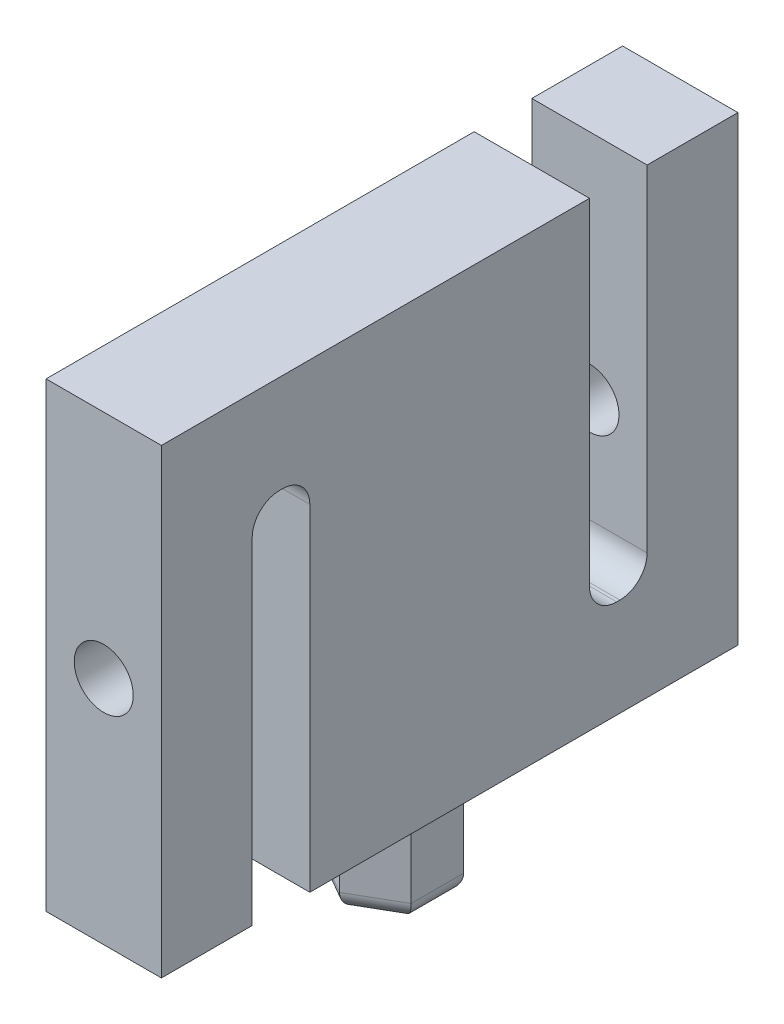
ISO-10303-21;
HEADER;
FILE_DESCRIPTION(('STEP AP214'),'2;1');
FILE_NAME('part.step','',(''),(''),'','','');
FILE_SCHEMA(('AUTOMOTIVE_DESIGN { 1 0 10303 214 1 1 1 1 }'));
ENDSEC;
DATA;
#1=APPLICATION_CONTEXT('core data for automotive mechanical design processes');
#2=APPLICATION_PROTOCOL_DEFINITION('international standard','automotive_design',2000,#1);
#3=PRODUCT_CONTEXT('',#1,'mechanical');
#4=PRODUCT('Part','Part','',(#3));
#5=PRODUCT_RELATED_PRODUCT_CATEGORY('part','',(#4));
#6=PRODUCT_DEFINITION_FORMATION('','',#4);
#7=PRODUCT_DEFINITION_CONTEXT('part definition',#1,'design');
#8=PRODUCT_DEFINITION('design','',#6,#7);
#9=PRODUCT_DEFINITION_SHAPE('','',#8);
#10=(LENGTH_UNIT() NAMED_UNIT(*) SI_UNIT(.MILLI.,.METRE.));
#11=(NAMED_UNIT(*) PLANE_ANGLE_UNIT() SI_UNIT($,.RADIAN.));
#12=(NAMED_UNIT(*) SI_UNIT($,.STERADIAN.) SOLID_ANGLE_UNIT());
#13=UNCERTAINTY_MEASURE_WITH_UNIT(LENGTH_MEASURE(1.E-05),#10,'distance_accuracy_value','');
#14=(GEOMETRIC_REPRESENTATION_CONTEXT(3) GLOBAL_UNCERTAINTY_ASSIGNED_CONTEXT((#13)) GLOBAL_UNIT_ASSIGNED_CONTEXT((#10,
#11,#12)) REPRESENTATION_CONTEXT('',''));
#15=CARTESIAN_POINT('',(0.,0.,0.));
#16=DIRECTION('',(0.,0.,1.));
#17=DIRECTION('',(1.,0.,0.));
#18=AXIS2_PLACEMENT_3D('',#15,#16,#17);
#19=CARTESIAN_POINT('',(0.,244.,70.4264973081038));
#20=DIRECTION('',(-0.5,0.,0.866025403784439));
#21=DIRECTION('',(0.866025403784439,0.,0.5));
#22=AXIS2_PLACEMENT_3D('',#19,#20,#21);
#23=PLANE('',#22);
#24=DIRECTION('',(0.,1.,0.));
#25=VECTOR('',#24,1.);
#26=CARTESIAN_POINT('',(5.,244.,73.3132486540519));
#27=LINE('',#26,#25);
#28=CARTESIAN_POINT('',(5.,246.,73.3132486540519));
#29=VERTEX_POINT('',#28);
#30=CARTESIAN_POINT('',(5.,254.,73.3132486540519));
#31=VERTEX_POINT('',#30);
#32=EDGE_CURVE('E127',#29,#31,#27,.T.);
#33=ORIENTED_EDGE('',*,*,#32,.F.);
#34=DIRECTION('',(0.866025403784439,0.,0.5));
#35=VECTOR('',#34,1.);
#36=CARTESIAN_POINT('',(0.,246.,70.4264973081038));
#37=LINE('',#36,#35);
#38=CARTESIAN_POINT('',(0.,246.,70.4264973081038));
#39=VERTEX_POINT('',#38);
#40=EDGE_CURVE('E12',#29,#39,#37,.F.);
#41=ORIENTED_EDGE('',*,*,#40,.T.);
#42=DIRECTION('',(0.,1.,0.));
#43=VECTOR('',#42,1.);
#44=CARTESIAN_POINT('',(0.,244.,70.4264973081038));
#45=LINE('',#44,#43);
#46=CARTESIAN_POINT('',(0.,254.,70.4264973081038));
#47=VERTEX_POINT('',#46);
#48=EDGE_CURVE('E148',#39,#47,#45,.T.);
#49=ORIENTED_EDGE('',*,*,#48,.T.);
#50=DIRECTION('',(0.866025403784439,0.,0.5));
#51=VECTOR('',#50,1.);
#52=CARTESIAN_POINT('',(0.,254.,70.4264973081038));
#53=LINE('',#52,#51);
#54=EDGE_CURVE('E142',#47,#31,#53,.T.);
#55=ORIENTED_EDGE('',*,*,#54,.T.);
#56=EDGE_LOOP('',(#33,#41,#49,#55));
#57=FACE_BOUND('',#56,.T.);
#58=ADVANCED_FACE('F57',(#57),#23,.F.);
#59=CARTESIAN_POINT('',(5.,244.,73.3132486540519));
#60=DIRECTION('',(-1.,0.,0.));
#61=DIRECTION('',(0.,0.,1.));
#62=AXIS2_PLACEMENT_3D('',#59,#60,#61);
#63=PLANE('',#62);
#64=DIRECTION('',(0.,1.,0.));
#65=VECTOR('',#64,1.);
#66=CARTESIAN_POINT('',(5.,244.,79.0867513459482));
#67=LINE('',#66,#65);
#68=CARTESIAN_POINT('',(5.,246.,79.0867513459482));
#69=VERTEX_POINT('',#68);
#70=CARTESIAN_POINT('',(5.,254.,79.0867513459482));
#71=VERTEX_POINT('',#70);
#72=EDGE_CURVE('E136',#69,#71,#67,.T.);
#73=ORIENTED_EDGE('',*,*,#72,.F.);
#74=DIRECTION('',(0.,0.,1.));
#75=VECTOR('',#74,1.);
#76=CARTESIAN_POINT('',(5.,246.,73.3132486540519));
#77=LINE('',#76,#75);
#78=EDGE_CURVE('E66',#69,#29,#77,.F.);
#79=ORIENTED_EDGE('',*,*,#78,.T.);
#80=ORIENTED_EDGE('',*,*,#32,.T.);
#81=DIRECTION('',(0.,0.,1.));
#82=VECTOR('',#81,1.);
#83=CARTESIAN_POINT('',(5.,254.,73.3132486540519));
#84=LINE('',#83,#82);
#85=EDGE_CURVE('E130',#31,#71,#84,.T.);
#86=ORIENTED_EDGE('',*,*,#85,.T.);
#87=EDGE_LOOP('',(#73,#79,#80,#86));
#88=FACE_BOUND('',#87,.T.);
#89=ADVANCED_FACE('F129',(#88),#63,.F.);
#90=CARTESIAN_POINT('',(5.,244.,79.0867513459482));
#91=DIRECTION('',(-0.499999999999999,0.,-0.866025403784439));
#92=DIRECTION('',(-0.866025403784439,0.,0.499999999999999));
#93=AXIS2_PLACEMENT_3D('',#90,#91,#92);
#94=PLANE('',#93);
#95=DIRECTION('',(0.,1.,0.));
#96=VECTOR('',#95,1.);
#97=CARTESIAN_POINT('',(0.,244.,81.9735026918963));
#98=LINE('',#97,#96);
#99=CARTESIAN_POINT('',(0.,246.,81.9735026918963));
#100=VERTEX_POINT('',#99);
#101=CARTESIAN_POINT('',(0.,254.,81.9735026918963));
#102=VERTEX_POINT('',#101);
#103=EDGE_CURVE('E168',#100,#102,#98,.T.);
#104=ORIENTED_EDGE('',*,*,#103,.F.);
#105=DIRECTION('',(-0.866025403784439,0.,0.499999999999999));
#106=VECTOR('',#105,1.);
#107=CARTESIAN_POINT('',(5.00000000000001,246.,79.0867513459482));
#108=LINE('',#107,#106);
#109=EDGE_CURVE('E81',#100,#69,#108,.F.);
#110=ORIENTED_EDGE('',*,*,#109,.T.);
#111=ORIENTED_EDGE('',*,*,#72,.T.);
#112=DIRECTION('',(-0.866025403784439,0.,0.499999999999999));
#113=VECTOR('',#112,1.);
#114=CARTESIAN_POINT('',(5.,254.,79.0867513459482));
#115=LINE('',#114,#113);
#116=EDGE_CURVE('E145',#71,#102,#115,.T.);
#117=ORIENTED_EDGE('',*,*,#116,.T.);
#118=EDGE_LOOP('',(#104,#110,#111,#117));
#119=FACE_BOUND('',#118,.T.);
#120=ADVANCED_FACE('F251',(#119),#94,.F.);
#121=CARTESIAN_POINT('',(0.,244.,81.9735026918963));
#122=DIRECTION('',(0.5,0.,-0.866025403784439));
#123=DIRECTION('',(-0.866025403784439,0.,-0.5));
#124=AXIS2_PLACEMENT_3D('',#121,#122,#123);
#125=PLANE('',#124);
#126=DIRECTION('',(0.,1.,0.));
#127=VECTOR('',#126,1.);
#128=CARTESIAN_POINT('',(-5.,244.,79.0867513459482));
#129=LINE('',#128,#127);
#130=CARTESIAN_POINT('',(-5.,246.,79.0867513459482));
#131=VERTEX_POINT('',#130);
#132=CARTESIAN_POINT('',(-5.,254.,79.0867513459482));
#133=VERTEX_POINT('',#132);
#134=EDGE_CURVE('E166',#131,#133,#129,.T.);
#135=ORIENTED_EDGE('',*,*,#134,.F.);
#136=DIRECTION('',(-0.866025403784439,0.,-0.5));
#137=VECTOR('',#136,1.);
#138=CARTESIAN_POINT('',(0.,246.,81.9735026918963));
#139=LINE('',#138,#137);
#140=EDGE_CURVE('E188',#131,#100,#139,.F.);
#141=ORIENTED_EDGE('',*,*,#140,.T.);
#142=ORIENTED_EDGE('',*,*,#103,.T.);
#143=DIRECTION('',(-0.866025403784439,0.,-0.5));
#144=VECTOR('',#143,1.);
#145=CARTESIAN_POINT('',(0.,254.,81.9735026918963));
#146=LINE('',#145,#144);
#147=EDGE_CURVE('E155',#102,#133,#146,.T.);
#148=ORIENTED_EDGE('',*,*,#147,.T.);
#149=EDGE_LOOP('',(#135,#141,#142,#148));
#150=FACE_BOUND('',#149,.T.);
#151=ADVANCED_FACE('F235',(#150),#125,.F.);
#152=CARTESIAN_POINT('',(-5.,244.,79.0867513459482));
#153=DIRECTION('',(1.,0.,0.));
#154=DIRECTION('',(0.,0.,-1.));
#155=AXIS2_PLACEMENT_3D('',#152,#153,#154);
#156=PLANE('',#155);
#157=DIRECTION('',(0.,1.,0.));
#158=VECTOR('',#157,1.);
#159=CARTESIAN_POINT('',(-5.,244.,73.3132486540519));
#160=LINE('',#159,#158);
#161=CARTESIAN_POINT('',(-5.,246.,73.3132486540519));
#162=VERTEX_POINT('',#161);
#163=CARTESIAN_POINT('',(-5.,254.,73.3132486540519));
#164=VERTEX_POINT('',#163);
#165=EDGE_CURVE('E164',#162,#164,#160,.T.);
#166=ORIENTED_EDGE('',*,*,#165,.F.);
#167=DIRECTION('',(0.,0.,-1.));
#168=VECTOR('',#167,1.);
#169=CARTESIAN_POINT('',(-5.,246.,79.0867513459482));
#170=LINE('',#169,#168);
#171=EDGE_CURVE('E186',#162,#131,#170,.F.);
#172=ORIENTED_EDGE('',*,*,#171,.T.);
#173=ORIENTED_EDGE('',*,*,#134,.T.);
#174=DIRECTION('',(0.,0.,-1.));
#175=VECTOR('',#174,1.);
#176=CARTESIAN_POINT('',(-5.,254.,79.0867513459482));
#177=LINE('',#176,#175);
#178=EDGE_CURVE('E158',#133,#164,#177,.T.);
#179=ORIENTED_EDGE('',*,*,#178,.T.);
#180=EDGE_LOOP('',(#166,#172,#173,#179));
#181=FACE_BOUND('',#180,.T.);
#182=ADVANCED_FACE('F232',(#181),#156,.F.);
#183=CARTESIAN_POINT('',(-5.,244.,73.3132486540519));
#184=DIRECTION('',(0.499999999999999,0.,0.866025403784439));
#185=DIRECTION('',(0.866025403784439,0.,-0.5));
#186=AXIS2_PLACEMENT_3D('',#183,#184,#185);
#187=PLANE('',#186);
#188=ORIENTED_EDGE('',*,*,#48,.F.);
#189=DIRECTION('',(0.866025403784439,0.,-0.5));
#190=VECTOR('',#189,1.);
#191=CARTESIAN_POINT('',(-5.,246.,73.3132486540519));
#192=LINE('',#191,#190);
#193=EDGE_CURVE('E183',#39,#162,#192,.F.);
#194=ORIENTED_EDGE('',*,*,#193,.T.);
#195=ORIENTED_EDGE('',*,*,#165,.T.);
#196=DIRECTION('',(0.866025403784439,0.,-0.499999999999999));
#197=VECTOR('',#196,1.);
#198=CARTESIAN_POINT('',(-5.,254.,73.3132486540519));
#199=LINE('',#198,#197);
#200=EDGE_CURVE('E161',#164,#47,#199,.T.);
#201=ORIENTED_EDGE('',*,*,#200,.T.);
#202=EDGE_LOOP('',(#188,#194,#195,#201));
#203=FACE_BOUND('',#202,.T.);
#204=ADVANCED_FACE('F221',(#203),#187,.F.);
#205=CARTESIAN_POINT('',(0.,244.,0.));
#206=DIRECTION('',(0.,-1.,0.));
#207=DIRECTION('',(0.,0.,-1.));
#208=AXIS2_PLACEMENT_3D('',#205,#206,#207);
#209=PLANE('',#208);
#210=DIRECTION('',(0.,0.,-1.));
#211=VECTOR('',#210,1.);
#212=CARTESIAN_POINT('',(-3.,244.,73.3132486540519));
#213=LINE('',#212,#211);
#214=CARTESIAN_POINT('',(-3.,244.,77.9320508075689));
#215=VERTEX_POINT('',#214);
#216=CARTESIAN_POINT('',(-3.,244.,74.4679491924312));
#217=VERTEX_POINT('',#216);
#218=EDGE_CURVE('E178',#215,#217,#213,.T.);
#219=ORIENTED_EDGE('',*,*,#218,.T.);
#220=DIRECTION('',(0.866025403784439,0.,-0.5));
#221=VECTOR('',#220,1.);
#222=CARTESIAN_POINT('',(1.00000000000001,244.,72.1585481156727));
#223=LINE('',#222,#221);
#224=CARTESIAN_POINT('',(0.,244.,72.7358983848623));
#225=VERTEX_POINT('',#224);
#226=EDGE_CURVE('E180',#217,#225,#223,.T.);
#227=ORIENTED_EDGE('',*,*,#226,.T.);
#228=DIRECTION('',(0.866025403784439,0.,0.5));
#229=VECTOR('',#228,1.);
#230=CARTESIAN_POINT('',(4.00000000000002,244.,75.0452994616208));
#231=LINE('',#230,#229);
#232=CARTESIAN_POINT('',(3.,244.,74.4679491924311));
#233=VERTEX_POINT('',#232);
#234=EDGE_CURVE('E135',#225,#233,#231,.T.);
#235=ORIENTED_EDGE('',*,*,#234,.T.);
#236=DIRECTION('',(0.,0.,1.));
#237=VECTOR('',#236,1.);
#238=CARTESIAN_POINT('',(3.,244.,79.0867513459482));
#239=LINE('',#238,#237);
#240=CARTESIAN_POINT('',(3.,244.,77.9320508075689));
#241=VERTEX_POINT('',#240);
#242=EDGE_CURVE('E172',#233,#241,#239,.T.);
#243=ORIENTED_EDGE('',*,*,#242,.T.);
#244=DIRECTION('',(-0.866025403784439,0.,0.499999999999999));
#245=VECTOR('',#244,1.);
#246=CARTESIAN_POINT('',(-0.999999999999973,244.,80.2414518843274));
#247=LINE('',#246,#245);
#248=CARTESIAN_POINT('',(0.,244.,79.6641016151378));
#249=VERTEX_POINT('',#248);
#250=EDGE_CURVE('E174',#241,#249,#247,.T.);
#251=ORIENTED_EDGE('',*,*,#250,.T.);
#252=DIRECTION('',(-0.866025403784439,0.,-0.5));
#253=VECTOR('',#252,1.);
#254=CARTESIAN_POINT('',(-4.00000000000001,244.,77.3547005383793));
#255=LINE('',#254,#253);
#256=EDGE_CURVE('E176',#249,#215,#255,.T.);
#257=ORIENTED_EDGE('',*,*,#256,.T.);
#258=EDGE_LOOP('',(#219,#227,#235,#243,#251,#257));
#259=FACE_BOUND('',#258,.T.);
#260=ADVANCED_FACE('F211',(#259),#209,.T.);
#261=CARTESIAN_POINT('',(0.,254.,0.));
#262=DIRECTION('',(0.,-1.,0.));
#263=DIRECTION('',(0.,0.,-1.));
#264=AXIS2_PLACEMENT_3D('',#261,#262,#263);
#265=PLANE('',#264);
#266=ORIENTED_EDGE('',*,*,#54,.F.);
#267=ORIENTED_EDGE('',*,*,#200,.F.);
#268=ORIENTED_EDGE('',*,*,#178,.F.);
#269=ORIENTED_EDGE('',*,*,#147,.F.);
#270=ORIENTED_EDGE('',*,*,#116,.F.);
#271=ORIENTED_EDGE('',*,*,#85,.F.);
#272=EDGE_LOOP('',(#266,#267,#268,#269,#270,#271));
#273=FACE_BOUND('',#272,.T.);
#274=ADVANCED_FACE('F140',(#273),#265,.F.);
#275=CARTESIAN_POINT('',(34.4955678841871,246.,59.7480762113534));
#276=DIRECTION('',(0.866025403784439,0.,-0.499999999999999));
#277=DIRECTION('',(-0.499999999999999,0.,-0.866025403784439));
#278=AXIS2_PLACEMENT_3D('',#275,#276,#277);
#279=CYLINDRICAL_SURFACE('',#278,2.);
#280=CARTESIAN_POINT('',(3.,246.,77.9320508075689));
#281=DIRECTION('',(0.5,0.,-0.866025403784438));
#282=DIRECTION('',(-0.866025403784438,0.,-0.5));
#283=AXIS2_PLACEMENT_3D('',#280,#281,#282);
#284=ELLIPSE('',#283,2.3094010767585,2.);
#285=EDGE_CURVE('E152',#69,#241,#284,.T.);
#286=ORIENTED_EDGE('',*,*,#285,.F.);
#287=ORIENTED_EDGE('',*,*,#109,.F.);
#288=CARTESIAN_POINT('',(0.,246.,79.6641016151378));
#289=DIRECTION('',(1.,0.,0.));
#290=DIRECTION('',(0.,0.,-1.));
#291=AXIS2_PLACEMENT_3D('',#288,#289,#290);
#292=ELLIPSE('',#291,2.3094010767585,2.);
#293=EDGE_CURVE('E61',#249,#100,#292,.F.);
#294=ORIENTED_EDGE('',*,*,#293,.F.);
#295=ORIENTED_EDGE('',*,*,#250,.F.);
#296=EDGE_LOOP('',(#286,#287,#294,#295));
#297=FACE_BOUND('',#296,.T.);
#298=ADVANCED_FACE('F59',(#297),#279,.T.);
#299=CARTESIAN_POINT('',(-34.4955678841871,246.,59.7480762113534));
#300=DIRECTION('',(0.866025403784439,0.,0.5));
#301=DIRECTION('',(0.5,0.,-0.866025403784439));
#302=AXIS2_PLACEMENT_3D('',#299,#300,#301);
#303=CYLINDRICAL_SURFACE('',#302,2.);
#304=ORIENTED_EDGE('',*,*,#293,.T.);
#305=ORIENTED_EDGE('',*,*,#140,.F.);
#306=CARTESIAN_POINT('',(-3.,246.,77.9320508075689));
#307=DIRECTION('',(0.5,0.,0.866025403784438));
#308=DIRECTION('',(0.866025403784439,0.,-0.5));
#309=AXIS2_PLACEMENT_3D('',#306,#307,#308);
#310=ELLIPSE('',#309,2.3094010767585,2.);
#311=EDGE_CURVE('E199',#215,#131,#310,.F.);
#312=ORIENTED_EDGE('',*,*,#311,.F.);
#313=ORIENTED_EDGE('',*,*,#256,.F.);
#314=EDGE_LOOP('',(#304,#305,#312,#313));
#315=FACE_BOUND('',#314,.T.);
#316=ADVANCED_FACE('F238',(#315),#303,.T.);
#317=CARTESIAN_POINT('',(3.,246.,0.));
#318=DIRECTION('',(0.,0.,-1.));
#319=DIRECTION('',(-1.,0.,0.));
#320=AXIS2_PLACEMENT_3D('',#317,#318,#319);
#321=CYLINDRICAL_SURFACE('',#320,2.);
#322=ORIENTED_EDGE('',*,*,#285,.T.);
#323=ORIENTED_EDGE('',*,*,#242,.F.);
#324=CARTESIAN_POINT('',(3.,246.,74.4679491924311));
#325=DIRECTION('',(-0.5,0.,-0.866025403784438));
#326=DIRECTION('',(-0.866025403784439,0.,0.5));
#327=AXIS2_PLACEMENT_3D('',#324,#325,#326);
#328=ELLIPSE('',#327,2.3094010767585,2.);
#329=EDGE_CURVE('E196',#29,#233,#328,.T.);
#330=ORIENTED_EDGE('',*,*,#329,.F.);
#331=ORIENTED_EDGE('',*,*,#78,.F.);
#332=EDGE_LOOP('',(#322,#323,#330,#331));
#333=FACE_BOUND('',#332,.T.);
#334=ADVANCED_FACE('F205',(#333),#321,.T.);
#335=CARTESIAN_POINT('',(-2.99999999999999,246.,0.));
#336=DIRECTION('',(0.,0.,1.));
#337=DIRECTION('',(1.,0.,0.));
#338=AXIS2_PLACEMENT_3D('',#335,#336,#337);
#339=CYLINDRICAL_SURFACE('',#338,2.);
#340=ORIENTED_EDGE('',*,*,#311,.T.);
#341=ORIENTED_EDGE('',*,*,#171,.F.);
#342=CARTESIAN_POINT('',(-3.,246.,74.4679491924311));
#343=DIRECTION('',(-0.5,0.,0.866025403784438));
#344=DIRECTION('',(0.866025403784439,0.,0.5));
#345=AXIS2_PLACEMENT_3D('',#342,#343,#344);
#346=ELLIPSE('',#345,2.3094010767585,2.);
#347=EDGE_CURVE('E194',#217,#162,#346,.F.);
#348=ORIENTED_EDGE('',*,*,#347,.F.);
#349=ORIENTED_EDGE('',*,*,#218,.F.);
#350=EDGE_LOOP('',(#340,#341,#348,#349));
#351=FACE_BOUND('',#350,.T.);
#352=ADVANCED_FACE('F229',(#351),#339,.T.);
#353=CARTESIAN_POINT('',(-31.4955678841871,246.,54.5519237886467));
#354=DIRECTION('',(-0.866025403784439,0.,-0.5));
#355=DIRECTION('',(-0.5,0.,0.866025403784439));
#356=AXIS2_PLACEMENT_3D('',#353,#354,#355);
#357=CYLINDRICAL_SURFACE('',#356,2.);
#358=ORIENTED_EDGE('',*,*,#329,.T.);
#359=ORIENTED_EDGE('',*,*,#234,.F.);
#360=CARTESIAN_POINT('',(0.,246.,72.7358983848623));
#361=DIRECTION('',(-1.,0.,0.));
#362=DIRECTION('',(0.,0.,-1.));
#363=AXIS2_PLACEMENT_3D('',#360,#361,#362);
#364=ELLIPSE('',#363,2.3094010767585,2.);
#365=EDGE_CURVE('E192',#39,#225,#364,.T.);
#366=ORIENTED_EDGE('',*,*,#365,.F.);
#367=ORIENTED_EDGE('',*,*,#40,.F.);
#368=EDGE_LOOP('',(#358,#359,#366,#367));
#369=FACE_BOUND('',#368,.T.);
#370=ADVANCED_FACE('F217',(#369),#357,.T.);
#371=CARTESIAN_POINT('',(31.4955678841871,246.,54.5519237886468));
#372=DIRECTION('',(-0.866025403784439,0.,0.5));
#373=DIRECTION('',(0.499999999999999,0.,0.866025403784439));
#374=AXIS2_PLACEMENT_3D('',#371,#372,#373);
#375=CYLINDRICAL_SURFACE('',#374,2.);
#376=ORIENTED_EDGE('',*,*,#347,.T.);
#377=ORIENTED_EDGE('',*,*,#193,.F.);
#378=ORIENTED_EDGE('',*,*,#365,.T.);
#379=ORIENTED_EDGE('',*,*,#226,.F.);
#380=EDGE_LOOP('',(#376,#377,#378,#379));
#381=FACE_BOUND('',#380,.T.);
#382=ADVANCED_FACE('F224',(#381),#375,.T.);
#383=CLOSED_SHELL('',(#58,#89,#120,#151,#182,#204,#260,#274,#298,#316,#334,#352,#370,#382));
#384=MANIFOLD_SOLID_BREP('B2',#383);
#385=CARTESIAN_POINT('',(6.35,264.8,54.45));
#386=DIRECTION('',(0.,-1.,0.));
#387=DIRECTION('',(0.,0.,-1.));
#388=AXIS2_PLACEMENT_3D('',#385,#386,#387);
#389=PLANE('',#388);
#390=DIRECTION('',(0.,0.,1.));
#391=VECTOR('',#390,1.);
#392=CARTESIAN_POINT('',(-6.35,264.8,54.45));
#393=LINE('',#392,#391);
#394=CARTESIAN_POINT('',(-6.35,264.8,57.45));
#395=VERTEX_POINT('',#394);
#396=CARTESIAN_POINT('',(-6.35,264.8,57.8));
#397=VERTEX_POINT('',#396);
#398=EDGE_CURVE('E516',#395,#397,#393,.T.);
#399=ORIENTED_EDGE('',*,*,#398,.T.);
#400=DIRECTION('',(-1.,0.,0.));
#401=VECTOR('',#400,1.);
#402=CARTESIAN_POINT('',(6.35,264.8,57.8));
#403=LINE('',#402,#401);
#404=CARTESIAN_POINT('',(6.35,264.8,57.8));
#405=VERTEX_POINT('',#404);
#406=EDGE_CURVE('E565',#397,#405,#403,.F.);
#407=ORIENTED_EDGE('',*,*,#406,.T.);
#408=DIRECTION('',(0.,0.,1.));
#409=VECTOR('',#408,1.);
#410=CARTESIAN_POINT('',(6.35,264.8,54.45));
#411=LINE('',#410,#409);
#412=CARTESIAN_POINT('',(6.35,264.8,57.45));
#413=VERTEX_POINT('',#412);
#414=EDGE_CURVE('E478',#413,#405,#411,.T.);
#415=ORIENTED_EDGE('',*,*,#414,.F.);
#416=DIRECTION('',(-1.,0.,0.));
#417=VECTOR('',#416,1.);
#418=CARTESIAN_POINT('',(-6.35,264.8,57.45));
#419=LINE('',#418,#417);
#420=EDGE_CURVE('E562',#413,#395,#419,.T.);
#421=ORIENTED_EDGE('',*,*,#420,.T.);
#422=EDGE_LOOP('',(#399,#407,#415,#421));
#423=FACE_BOUND('',#422,.T.);
#424=ADVANCED_FACE('F353',(#423),#389,.F.);
#425=CARTESIAN_POINT('',(6.35,264.8,60.8));
#426=DIRECTION('',(0.,0.,1.));
#427=DIRECTION('',(0.,-1.,0.));
#428=AXIS2_PLACEMENT_3D('',#425,#426,#427);
#429=PLANE('',#428);
#430=DIRECTION('',(0.,1.,0.));
#431=VECTOR('',#430,1.);
#432=CARTESIAN_POINT('',(6.35,264.8,60.8));
#433=LINE('',#432,#431);
#434=CARTESIAN_POINT('',(6.35,267.8,60.8));
#435=VERTEX_POINT('',#434);
#436=CARTESIAN_POINT('',(6.35,304.8,60.8));
#437=VERTEX_POINT('',#436);
#438=EDGE_CURVE('E465',#435,#437,#433,.T.);
#439=ORIENTED_EDGE('',*,*,#438,.F.);
#440=DIRECTION('',(-1.,0.,0.));
#441=VECTOR('',#440,1.);
#442=CARTESIAN_POINT('',(-6.35,267.8,60.8));
#443=LINE('',#442,#441);
#444=CARTESIAN_POINT('',(-6.35,267.8,60.8));
#445=VERTEX_POINT('',#444);
#446=EDGE_CURVE('E487',#435,#445,#443,.T.);
#447=ORIENTED_EDGE('',*,*,#446,.T.);
#448=DIRECTION('',(0.,1.,0.));
#449=VECTOR('',#448,1.);
#450=CARTESIAN_POINT('',(-6.35,264.8,60.8));
#451=LINE('',#450,#449);
#452=CARTESIAN_POINT('',(-6.35,304.8,60.8));
#453=VERTEX_POINT('',#452);
#454=EDGE_CURVE('E484',#445,#453,#451,.T.);
#455=ORIENTED_EDGE('',*,*,#454,.T.);
#456=DIRECTION('',(-1.,0.,0.));
#457=VECTOR('',#456,1.);
#458=CARTESIAN_POINT('',(6.35,304.8,60.8));
#459=LINE('',#458,#457);
#460=EDGE_CURVE('E481',#437,#453,#459,.T.);
#461=ORIENTED_EDGE('',*,*,#460,.F.);
#462=EDGE_LOOP('',(#439,#447,#455,#461));
#463=FACE_BOUND('',#462,.T.);
#464=ADVANCED_FACE('F482',(#463),#429,.F.);
#465=CARTESIAN_POINT('',(6.35,304.8,60.8));
#466=DIRECTION('',(0.,-1.,0.));
#467=DIRECTION('',(0.,0.,-1.));
#468=AXIS2_PLACEMENT_3D('',#465,#466,#467);
#469=PLANE('',#468);
#470=DIRECTION('',(0.,0.,1.));
#471=VECTOR('',#470,1.);
#472=CARTESIAN_POINT('',(-6.35,304.8,60.8));
#473=LINE('',#472,#471);
#474=CARTESIAN_POINT('',(-6.35,304.8,107.95));
#475=VERTEX_POINT('',#474);
#476=EDGE_CURVE('E521',#453,#475,#473,.T.);
#477=ORIENTED_EDGE('',*,*,#476,.T.);
#478=DIRECTION('',(-1.,0.,0.));
#479=VECTOR('',#478,1.);
#480=CARTESIAN_POINT('',(6.35,304.8,107.95));
#481=LINE('',#480,#479);
#482=CARTESIAN_POINT('',(6.35,304.8,107.95));
#483=VERTEX_POINT('',#482);
#484=EDGE_CURVE('E488',#483,#475,#481,.T.);
#485=ORIENTED_EDGE('',*,*,#484,.F.);
#486=DIRECTION('',(0.,0.,1.));
#487=VECTOR('',#486,1.);
#488=CARTESIAN_POINT('',(6.35,304.8,60.8));
#489=LINE('',#488,#487);
#490=EDGE_CURVE('E470',#437,#483,#489,.T.);
#491=ORIENTED_EDGE('',*,*,#490,.F.);
#492=ORIENTED_EDGE('',*,*,#460,.T.);
#493=EDGE_LOOP('',(#477,#485,#491,#492));
#494=FACE_BOUND('',#493,.T.);
#495=ADVANCED_FACE('F490',(#494),#469,.F.);
#496=CARTESIAN_POINT('',(6.35,304.8,107.95));
#497=DIRECTION('',(0.,0.,-1.));
#498=DIRECTION('',(-1.,0.,0.));
#499=AXIS2_PLACEMENT_3D('',#496,#497,#498);
#500=PLANE('',#499);
#501=CARTESIAN_POINT('',(0.,279.4,107.95));
#502=DIRECTION('',(0.,0.,-1.));
#503=DIRECTION('',(0.,1.,0.));
#504=AXIS2_PLACEMENT_3D('',#501,#502,#503);
#505=CIRCLE('',#504,3.25);
#506=CARTESIAN_POINT('',(0.,282.65,107.95));
#507=VERTEX_POINT('',#506);
#508=EDGE_CURVE('E699',#507,#507,#505,.T.);
#509=ORIENTED_EDGE('',*,*,#508,.T.);
#510=EDGE_LOOP('',(#509));
#511=FACE_BOUND('',#510,.T.);
#512=DIRECTION('',(0.,-1.,0.));
#513=VECTOR('',#512,1.);
#514=CARTESIAN_POINT('',(-6.35,304.8,107.95));
#515=LINE('',#514,#513);
#516=CARTESIAN_POINT('',(-6.35,254.,107.95));
#517=VERTEX_POINT('',#516);
#518=EDGE_CURVE('E523',#475,#517,#515,.T.);
#519=ORIENTED_EDGE('',*,*,#518,.T.);
#520=DIRECTION('',(-1.,0.,0.));
#521=VECTOR('',#520,1.);
#522=CARTESIAN_POINT('',(6.35,254.,107.95));
#523=LINE('',#522,#521);
#524=CARTESIAN_POINT('',(6.35,254.,107.95));
#525=VERTEX_POINT('',#524);
#526=EDGE_CURVE('E557',#525,#517,#523,.T.);
#527=ORIENTED_EDGE('',*,*,#526,.F.);
#528=DIRECTION('',(0.,-1.,0.));
#529=VECTOR('',#528,1.);
#530=CARTESIAN_POINT('',(6.35,304.8,107.95));
#531=LINE('',#530,#529);
#532=EDGE_CURVE('E493',#483,#525,#531,.T.);
#533=ORIENTED_EDGE('',*,*,#532,.F.);
#534=ORIENTED_EDGE('',*,*,#484,.T.);
#535=EDGE_LOOP('',(#519,#527,#533,#534));
#536=FACE_BOUND('',#535,.T.);
#537=ADVANCED_FACE('F617',(#511,#536),#500,.F.);
#538=CARTESIAN_POINT('',(6.35,254.,107.95));
#539=DIRECTION('',(0.,1.,0.));
#540=DIRECTION('',(0.,0.,1.));
#541=AXIS2_PLACEMENT_3D('',#538,#539,#540);
#542=PLANE('',#541);
#543=DIRECTION('',(0.,0.,-1.));
#544=VECTOR('',#543,1.);
#545=CARTESIAN_POINT('',(-6.35,254.,107.95));
#546=LINE('',#545,#544);
#547=CARTESIAN_POINT('',(-6.35,254.,97.95));
#548=VERTEX_POINT('',#547);
#549=EDGE_CURVE('E525',#517,#548,#546,.T.);
#550=ORIENTED_EDGE('',*,*,#549,.T.);
#551=DIRECTION('',(-1.,0.,0.));
#552=VECTOR('',#551,1.);
#553=CARTESIAN_POINT('',(6.35,254.,97.95));
#554=LINE('',#553,#552);
#555=CARTESIAN_POINT('',(6.35,254.,97.95));
#556=VERTEX_POINT('',#555);
#557=EDGE_CURVE('E554',#556,#548,#554,.T.);
#558=ORIENTED_EDGE('',*,*,#557,.F.);
#559=DIRECTION('',(0.,0.,-1.));
#560=VECTOR('',#559,1.);
#561=CARTESIAN_POINT('',(6.35,254.,107.95));
#562=LINE('',#561,#560);
#563=EDGE_CURVE('E495',#525,#556,#562,.T.);
#564=ORIENTED_EDGE('',*,*,#563,.F.);
#565=ORIENTED_EDGE('',*,*,#526,.T.);
#566=EDGE_LOOP('',(#550,#558,#564,#565));
#567=FACE_BOUND('',#566,.T.);
#568=ADVANCED_FACE('F614',(#567),#542,.F.);
#569=CARTESIAN_POINT('',(6.35,254.,97.95));
#570=DIRECTION('',(0.,0.,1.));
#571=DIRECTION('',(0.,-1.,0.));
#572=AXIS2_PLACEMENT_3D('',#569,#570,#571);
#573=PLANE('',#572);
#574=CARTESIAN_POINT('',(0.,279.4,97.95));
#575=DIRECTION('',(0.,0.,1.));
#576=DIRECTION('',(0.,-1.,0.));
#577=AXIS2_PLACEMENT_3D('',#574,#575,#576);
#578=CIRCLE('',#577,3.25);
#579=CARTESIAN_POINT('',(0.,276.15,97.95));
#580=VERTEX_POINT('',#579);
#581=EDGE_CURVE('E696',#580,#580,#578,.T.);
#582=ORIENTED_EDGE('',*,*,#581,.T.);
#583=EDGE_LOOP('',(#582));
#584=FACE_BOUND('',#583,.T.);
#585=DIRECTION('',(0.,1.,0.));
#586=VECTOR('',#585,1.);
#587=CARTESIAN_POINT('',(-6.35,254.,97.95));
#588=LINE('',#587,#586);
#589=CARTESIAN_POINT('',(-6.35,291.,97.95));
#590=VERTEX_POINT('',#589);
#591=EDGE_CURVE('E527',#548,#590,#588,.T.);
#592=ORIENTED_EDGE('',*,*,#591,.T.);
#593=DIRECTION('',(-1.,0.,0.));
#594=VECTOR('',#593,1.);
#595=CARTESIAN_POINT('',(6.35,291.,97.95));
#596=LINE('',#595,#594);
#597=CARTESIAN_POINT('',(6.35,291.,97.95));
#598=VERTEX_POINT('',#597);
#599=EDGE_CURVE('E368',#590,#598,#596,.F.);
#600=ORIENTED_EDGE('',*,*,#599,.T.);
#601=DIRECTION('',(0.,1.,0.));
#602=VECTOR('',#601,1.);
#603=CARTESIAN_POINT('',(6.35,254.,97.95));
#604=LINE('',#603,#602);
#605=EDGE_CURVE('E500',#556,#598,#604,.T.);
#606=ORIENTED_EDGE('',*,*,#605,.F.);
#607=ORIENTED_EDGE('',*,*,#557,.T.);
#608=EDGE_LOOP('',(#592,#600,#606,#607));
#609=FACE_BOUND('',#608,.T.);
#610=ADVANCED_FACE('F610',(#584,#609),#573,.F.);
#611=CARTESIAN_POINT('',(6.35,294.,97.95));
#612=DIRECTION('',(0.,1.,0.));
#613=DIRECTION('',(0.,0.,1.));
#614=AXIS2_PLACEMENT_3D('',#611,#612,#613);
#615=PLANE('',#614);
#616=DIRECTION('',(0.,0.,-1.));
#617=VECTOR('',#616,1.);
#618=CARTESIAN_POINT('',(-6.35,294.,97.95));
#619=LINE('',#618,#617);
#620=CARTESIAN_POINT('',(-6.35,294.,94.95));
#621=VERTEX_POINT('',#620);
#622=CARTESIAN_POINT('',(-6.35,294.,94.6));
#623=VERTEX_POINT('',#622);
#624=EDGE_CURVE('E529',#621,#623,#619,.T.);
#625=ORIENTED_EDGE('',*,*,#624,.T.);
#626=DIRECTION('',(-1.,0.,0.));
#627=VECTOR('',#626,1.);
#628=CARTESIAN_POINT('',(6.35,294.,94.6));
#629=LINE('',#628,#627);
#630=CARTESIAN_POINT('',(6.35,294.,94.6));
#631=VERTEX_POINT('',#630);
#632=EDGE_CURVE('E575',#623,#631,#629,.F.);
#633=ORIENTED_EDGE('',*,*,#632,.T.);
#634=DIRECTION('',(0.,0.,-1.));
#635=VECTOR('',#634,1.);
#636=CARTESIAN_POINT('',(6.35,294.,97.95));
#637=LINE('',#636,#635);
#638=CARTESIAN_POINT('',(6.35,294.,94.95));
#639=VERTEX_POINT('',#638);
#640=EDGE_CURVE('E502',#639,#631,#637,.T.);
#641=ORIENTED_EDGE('',*,*,#640,.F.);
#642=DIRECTION('',(-1.,0.,0.));
#643=VECTOR('',#642,1.);
#644=CARTESIAN_POINT('',(-6.35,294.,94.95));
#645=LINE('',#644,#643);
#646=EDGE_CURVE('E572',#639,#621,#645,.T.);
#647=ORIENTED_EDGE('',*,*,#646,.T.);
#648=EDGE_LOOP('',(#625,#633,#641,#647));
#649=FACE_BOUND('',#648,.T.);
#650=ADVANCED_FACE('F604',(#649),#615,.F.);
#651=CARTESIAN_POINT('',(6.35,294.,91.6));
#652=DIRECTION('',(0.,0.,-1.));
#653=DIRECTION('',(-1.,0.,0.));
#654=AXIS2_PLACEMENT_3D('',#651,#652,#653);
#655=PLANE('',#654);
#656=DIRECTION('',(0.,-1.,0.));
#657=VECTOR('',#656,1.);
#658=CARTESIAN_POINT('',(6.35,294.,91.6));
#659=LINE('',#658,#657);
#660=CARTESIAN_POINT('',(6.35,291.,91.6));
#661=VERTEX_POINT('',#660);
#662=CARTESIAN_POINT('',(6.35,254.,91.6));
#663=VERTEX_POINT('',#662);
#664=EDGE_CURVE('E505',#661,#663,#659,.T.);
#665=ORIENTED_EDGE('',*,*,#664,.F.);
#666=DIRECTION('',(-1.,0.,0.));
#667=VECTOR('',#666,1.);
#668=CARTESIAN_POINT('',(-6.35,291.,91.6));
#669=LINE('',#668,#667);
#670=CARTESIAN_POINT('',(-6.35,291.,91.6));
#671=VERTEX_POINT('',#670);
#672=EDGE_CURVE('E569',#661,#671,#669,.T.);
#673=ORIENTED_EDGE('',*,*,#672,.T.);
#674=DIRECTION('',(0.,-1.,0.));
#675=VECTOR('',#674,1.);
#676=CARTESIAN_POINT('',(-6.35,294.,91.6));
#677=LINE('',#676,#675);
#678=CARTESIAN_POINT('',(-6.35,254.,91.6));
#679=VERTEX_POINT('',#678);
#680=EDGE_CURVE('E532',#671,#679,#677,.T.);
#681=ORIENTED_EDGE('',*,*,#680,.T.);
#682=DIRECTION('',(-1.,0.,0.));
#683=VECTOR('',#682,1.);
#684=CARTESIAN_POINT('',(6.35,254.,91.6));
#685=LINE('',#684,#683);
#686=EDGE_CURVE('E551',#663,#679,#685,.T.);
#687=ORIENTED_EDGE('',*,*,#686,.F.);
#688=EDGE_LOOP('',(#665,#673,#681,#687));
#689=FACE_BOUND('',#688,.T.);
#690=ADVANCED_FACE('F596',(#689),#655,.F.);
#691=CARTESIAN_POINT('',(6.35,254.,91.6));
#692=DIRECTION('',(0.,1.,0.));
#693=DIRECTION('',(0.,0.,1.));
#694=AXIS2_PLACEMENT_3D('',#691,#692,#693);
#695=PLANE('',#694);
#696=DIRECTION('',(0.,0.,-1.));
#697=VECTOR('',#696,1.);
#698=CARTESIAN_POINT('',(-6.35,254.,91.6));
#699=LINE('',#698,#697);
#700=CARTESIAN_POINT('',(-6.35,254.,44.45));
#701=VERTEX_POINT('',#700);
#702=EDGE_CURVE('E534',#679,#701,#699,.T.);
#703=ORIENTED_EDGE('',*,*,#702,.T.);
#704=DIRECTION('',(-1.,0.,0.));
#705=VECTOR('',#704,1.);
#706=CARTESIAN_POINT('',(6.35,254.,44.45));
#707=LINE('',#706,#705);
#708=CARTESIAN_POINT('',(6.35,254.,44.45));
#709=VERTEX_POINT('',#708);
#710=EDGE_CURVE('E548',#709,#701,#707,.T.);
#711=ORIENTED_EDGE('',*,*,#710,.F.);
#712=DIRECTION('',(0.,0.,-1.));
#713=VECTOR('',#712,1.);
#714=CARTESIAN_POINT('',(6.35,254.,91.6));
#715=LINE('',#714,#713);
#716=EDGE_CURVE('E507',#663,#709,#715,.T.);
#717=ORIENTED_EDGE('',*,*,#716,.F.);
#718=ORIENTED_EDGE('',*,*,#686,.T.);
#719=EDGE_LOOP('',(#703,#711,#717,#718));
#720=FACE_BOUND('',#719,.T.);
#721=ADVANCED_FACE('F680',(#720),#695,.F.);
#722=CARTESIAN_POINT('',(6.35,254.,44.45));
#723=DIRECTION('',(0.,0.,1.));
#724=DIRECTION('',(0.,-1.,0.));
#725=AXIS2_PLACEMENT_3D('',#722,#723,#724);
#726=PLANE('',#725);
#727=CARTESIAN_POINT('',(0.,279.4,44.45));
#728=DIRECTION('',(0.,0.,-1.));
#729=DIRECTION('',(0.,1.,0.));
#730=AXIS2_PLACEMENT_3D('',#727,#728,#729);
#731=CIRCLE('',#730,3.25);
#732=CARTESIAN_POINT('',(0.,282.65,44.45));
#733=VERTEX_POINT('',#732);
#734=EDGE_CURVE('E519',#733,#733,#731,.T.);
#735=ORIENTED_EDGE('',*,*,#734,.F.);
#736=EDGE_LOOP('',(#735));
#737=FACE_BOUND('',#736,.T.);
#738=DIRECTION('',(0.,1.,0.));
#739=VECTOR('',#738,1.);
#740=CARTESIAN_POINT('',(-6.35,254.,44.45));
#741=LINE('',#740,#739);
#742=CARTESIAN_POINT('',(-6.35,304.8,44.45));
#743=VERTEX_POINT('',#742);
#744=EDGE_CURVE('E536',#701,#743,#741,.T.);
#745=ORIENTED_EDGE('',*,*,#744,.T.);
#746=DIRECTION('',(-1.,0.,0.));
#747=VECTOR('',#746,1.);
#748=CARTESIAN_POINT('',(6.35,304.8,44.45));
#749=LINE('',#748,#747);
#750=CARTESIAN_POINT('',(6.35,304.8,44.45));
#751=VERTEX_POINT('',#750);
#752=EDGE_CURVE('E545',#751,#743,#749,.T.);
#753=ORIENTED_EDGE('',*,*,#752,.F.);
#754=DIRECTION('',(0.,1.,0.));
#755=VECTOR('',#754,1.);
#756=CARTESIAN_POINT('',(6.35,254.,44.45));
#757=LINE('',#756,#755);
#758=EDGE_CURVE('E509',#709,#751,#757,.T.);
#759=ORIENTED_EDGE('',*,*,#758,.F.);
#760=ORIENTED_EDGE('',*,*,#710,.T.);
#761=EDGE_LOOP('',(#745,#753,#759,#760));
#762=FACE_BOUND('',#761,.T.);
#763=ADVANCED_FACE('F676',(#737,#762),#726,.F.);
#764=CARTESIAN_POINT('',(6.35,304.8,44.45));
#765=DIRECTION('',(0.,-1.,0.));
#766=DIRECTION('',(0.,0.,-1.));
#767=AXIS2_PLACEMENT_3D('',#764,#765,#766);
#768=PLANE('',#767);
#769=DIRECTION('',(0.,0.,1.));
#770=VECTOR('',#769,1.);
#771=CARTESIAN_POINT('',(-6.35,304.8,44.45));
#772=LINE('',#771,#770);
#773=CARTESIAN_POINT('',(-6.35,304.8,54.45));
#774=VERTEX_POINT('',#773);
#775=EDGE_CURVE('E538',#743,#774,#772,.T.);
#776=ORIENTED_EDGE('',*,*,#775,.T.);
#777=DIRECTION('',(-1.,0.,0.));
#778=VECTOR('',#777,1.);
#779=CARTESIAN_POINT('',(6.35,304.8,54.45));
#780=LINE('',#779,#778);
#781=CARTESIAN_POINT('',(6.35,304.8,54.45));
#782=VERTEX_POINT('',#781);
#783=EDGE_CURVE('E515',#782,#774,#780,.T.);
#784=ORIENTED_EDGE('',*,*,#783,.F.);
#785=DIRECTION('',(0.,0.,1.));
#786=VECTOR('',#785,1.);
#787=CARTESIAN_POINT('',(6.35,304.8,44.45));
#788=LINE('',#787,#786);
#789=EDGE_CURVE('E511',#751,#782,#788,.T.);
#790=ORIENTED_EDGE('',*,*,#789,.F.);
#791=ORIENTED_EDGE('',*,*,#752,.T.);
#792=EDGE_LOOP('',(#776,#784,#790,#791));
#793=FACE_BOUND('',#792,.T.);
#794=ADVANCED_FACE('F673',(#793),#768,.F.);
#795=CARTESIAN_POINT('',(6.35,304.8,54.45));
#796=DIRECTION('',(0.,0.,-1.));
#797=DIRECTION('',(-1.,0.,0.));
#798=AXIS2_PLACEMENT_3D('',#795,#796,#797);
#799=PLANE('',#798);
#800=CARTESIAN_POINT('',(0.,279.4,54.45));
#801=DIRECTION('',(0.,0.,-1.));
#802=DIRECTION('',(-1.,0.,0.));
#803=AXIS2_PLACEMENT_3D('',#800,#801,#802);
#804=CIRCLE('',#803,3.25);
#805=CARTESIAN_POINT('',(-3.25,279.4,54.45));
#806=VERTEX_POINT('',#805);
#807=EDGE_CURVE('E698',#806,#806,#804,.F.);
#808=ORIENTED_EDGE('',*,*,#807,.F.);
#809=EDGE_LOOP('',(#808));
#810=FACE_BOUND('',#809,.T.);
#811=DIRECTION('',(0.,-1.,0.));
#812=VECTOR('',#811,1.);
#813=CARTESIAN_POINT('',(-6.35,304.8,54.45));
#814=LINE('',#813,#812);
#815=CARTESIAN_POINT('',(-6.35,267.8,54.45));
#816=VERTEX_POINT('',#815);
#817=EDGE_CURVE('E540',#774,#816,#814,.T.);
#818=ORIENTED_EDGE('',*,*,#817,.T.);
#819=DIRECTION('',(-1.,0.,0.));
#820=VECTOR('',#819,1.);
#821=CARTESIAN_POINT('',(6.35,267.8,54.45));
#822=LINE('',#821,#820);
#823=CARTESIAN_POINT('',(6.35,267.8,54.45));
#824=VERTEX_POINT('',#823);
#825=EDGE_CURVE('E567',#816,#824,#822,.F.);
#826=ORIENTED_EDGE('',*,*,#825,.T.);
#827=DIRECTION('',(0.,-1.,0.));
#828=VECTOR('',#827,1.);
#829=CARTESIAN_POINT('',(6.35,304.8,54.45));
#830=LINE('',#829,#828);
#831=EDGE_CURVE('E513',#782,#824,#830,.T.);
#832=ORIENTED_EDGE('',*,*,#831,.F.);
#833=ORIENTED_EDGE('',*,*,#783,.T.);
#834=EDGE_LOOP('',(#818,#826,#832,#833));
#835=FACE_BOUND('',#834,.T.);
#836=ADVANCED_FACE('F668',(#810,#835),#799,.F.);
#837=CARTESIAN_POINT('',(6.35,0.,0.));
#838=DIRECTION('',(-1.,0.,0.));
#839=DIRECTION('',(0.,0.,1.));
#840=AXIS2_PLACEMENT_3D('',#837,#838,#839);
#841=PLANE('',#840);
#842=ORIENTED_EDGE('',*,*,#831,.T.);
#843=CARTESIAN_POINT('',(6.35,267.8,57.45));
#844=DIRECTION('',(-1.,0.,0.));
#845=DIRECTION('',(0.,0.,1.));
#846=AXIS2_PLACEMENT_3D('',#843,#844,#845);
#847=CIRCLE('',#846,3.);
#848=EDGE_CURVE('E583',#824,#413,#847,.T.);
#849=ORIENTED_EDGE('',*,*,#848,.T.);
#850=ORIENTED_EDGE('',*,*,#414,.T.);
#851=CARTESIAN_POINT('',(6.35,267.8,57.8));
#852=DIRECTION('',(-1.,0.,0.));
#853=DIRECTION('',(0.,0.,1.));
#854=AXIS2_PLACEMENT_3D('',#851,#852,#853);
#855=CIRCLE('',#854,3.);
#856=EDGE_CURVE('E474',#405,#435,#855,.T.);
#857=ORIENTED_EDGE('',*,*,#856,.T.);
#858=ORIENTED_EDGE('',*,*,#438,.T.);
#859=ORIENTED_EDGE('',*,*,#490,.T.);
#860=ORIENTED_EDGE('',*,*,#532,.T.);
#861=ORIENTED_EDGE('',*,*,#563,.T.);
#862=ORIENTED_EDGE('',*,*,#605,.T.);
#863=CARTESIAN_POINT('',(6.35,291.,94.95));
#864=DIRECTION('',(-1.,0.,0.));
#865=DIRECTION('',(0.,0.,1.));
#866=AXIS2_PLACEMENT_3D('',#863,#864,#865);
#867=CIRCLE('',#866,3.);
#868=EDGE_CURVE('E55',#598,#639,#867,.T.);
#869=ORIENTED_EDGE('',*,*,#868,.T.);
#870=ORIENTED_EDGE('',*,*,#640,.T.);
#871=CARTESIAN_POINT('',(6.35,291.,94.6));
#872=DIRECTION('',(-1.,0.,0.));
#873=DIRECTION('',(0.,0.,1.));
#874=AXIS2_PLACEMENT_3D('',#871,#872,#873);
#875=CIRCLE('',#874,3.);
#876=EDGE_CURVE('E587',#631,#661,#875,.T.);
#877=ORIENTED_EDGE('',*,*,#876,.T.);
#878=ORIENTED_EDGE('',*,*,#664,.T.);
#879=ORIENTED_EDGE('',*,*,#716,.T.);
#880=ORIENTED_EDGE('',*,*,#758,.T.);
#881=ORIENTED_EDGE('',*,*,#789,.T.);
#882=EDGE_LOOP('',(#842,#849,#850,#857,#858,#859,#860,#861,#862,#869,#870,#877,#878,#879,#880,#881));
#883=FACE_BOUND('',#882,.T.);
#884=ADVANCED_FACE('F468',(#883),#841,.F.);
#885=CARTESIAN_POINT('',(-6.35,0.,0.));
#886=DIRECTION('',(-1.,0.,0.));
#887=DIRECTION('',(0.,0.,1.));
#888=AXIS2_PLACEMENT_3D('',#885,#886,#887);
#889=PLANE('',#888);
#890=ORIENTED_EDGE('',*,*,#398,.F.);
#891=CARTESIAN_POINT('',(-6.35,267.8,57.45));
#892=DIRECTION('',(-1.,0.,0.));
#893=DIRECTION('',(0.,0.,1.));
#894=AXIS2_PLACEMENT_3D('',#891,#892,#893);
#895=CIRCLE('',#894,3.);
#896=EDGE_CURVE('E581',#395,#816,#895,.F.);
#897=ORIENTED_EDGE('',*,*,#896,.T.);
#898=ORIENTED_EDGE('',*,*,#817,.F.);
#899=ORIENTED_EDGE('',*,*,#775,.F.);
#900=ORIENTED_EDGE('',*,*,#744,.F.);
#901=ORIENTED_EDGE('',*,*,#702,.F.);
#902=ORIENTED_EDGE('',*,*,#680,.F.);
#903=CARTESIAN_POINT('',(-6.35,291.,94.6));
#904=DIRECTION('',(-1.,0.,0.));
#905=DIRECTION('',(0.,0.,1.));
#906=AXIS2_PLACEMENT_3D('',#903,#904,#905);
#907=CIRCLE('',#906,3.);
#908=EDGE_CURVE('E585',#671,#623,#907,.F.);
#909=ORIENTED_EDGE('',*,*,#908,.T.);
#910=ORIENTED_EDGE('',*,*,#624,.F.);
#911=CARTESIAN_POINT('',(-6.35,291.,94.95));
#912=DIRECTION('',(-1.,0.,0.));
#913=DIRECTION('',(0.,0.,1.));
#914=AXIS2_PLACEMENT_3D('',#911,#912,#913);
#915=CIRCLE('',#914,3.);
#916=EDGE_CURVE('E361',#621,#590,#915,.F.);
#917=ORIENTED_EDGE('',*,*,#916,.T.);
#918=ORIENTED_EDGE('',*,*,#591,.F.);
#919=ORIENTED_EDGE('',*,*,#549,.F.);
#920=ORIENTED_EDGE('',*,*,#518,.F.);
#921=ORIENTED_EDGE('',*,*,#476,.F.);
#922=ORIENTED_EDGE('',*,*,#454,.F.);
#923=CARTESIAN_POINT('',(-6.35,267.8,57.8));
#924=DIRECTION('',(-1.,0.,0.));
#925=DIRECTION('',(0.,0.,1.));
#926=AXIS2_PLACEMENT_3D('',#923,#924,#925);
#927=CIRCLE('',#926,3.);
#928=EDGE_CURVE('E578',#445,#397,#927,.F.);
#929=ORIENTED_EDGE('',*,*,#928,.T.);
#930=EDGE_LOOP('',(#890,#897,#898,#899,#900,#901,#902,#909,#910,#917,#918,#919,#920,#921,#922,#929));
#931=FACE_BOUND('',#930,.T.);
#932=ADVANCED_FACE('F601',(#931),#889,.T.);
#933=CARTESIAN_POINT('',(6.35,267.8,57.8));
#934=DIRECTION('',(1.,0.,0.));
#935=DIRECTION('',(0.,0.,-1.));
#936=AXIS2_PLACEMENT_3D('',#933,#934,#935);
#937=CYLINDRICAL_SURFACE('',#936,3.);
#938=ORIENTED_EDGE('',*,*,#856,.F.);
#939=ORIENTED_EDGE('',*,*,#406,.F.);
#940=ORIENTED_EDGE('',*,*,#928,.F.);
#941=ORIENTED_EDGE('',*,*,#446,.F.);
#942=EDGE_LOOP('',(#938,#939,#940,#941));
#943=FACE_BOUND('',#942,.T.);
#944=ADVANCED_FACE('F639',(#943),#937,.F.);
#945=CARTESIAN_POINT('',(6.35,267.8,57.45));
#946=DIRECTION('',(1.,0.,0.));
#947=DIRECTION('',(0.,0.,-1.));
#948=AXIS2_PLACEMENT_3D('',#945,#946,#947);
#949=CYLINDRICAL_SURFACE('',#948,3.);
#950=ORIENTED_EDGE('',*,*,#848,.F.);
#951=ORIENTED_EDGE('',*,*,#825,.F.);
#952=ORIENTED_EDGE('',*,*,#896,.F.);
#953=ORIENTED_EDGE('',*,*,#420,.F.);
#954=EDGE_LOOP('',(#950,#951,#952,#953));
#955=FACE_BOUND('',#954,.T.);
#956=ADVANCED_FACE('F642',(#955),#949,.F.);
#957=CARTESIAN_POINT('',(6.35,291.,94.6));
#958=DIRECTION('',(1.,0.,0.));
#959=DIRECTION('',(0.,0.,-1.));
#960=AXIS2_PLACEMENT_3D('',#957,#958,#959);
#961=CYLINDRICAL_SURFACE('',#960,3.);
#962=ORIENTED_EDGE('',*,*,#876,.F.);
#963=ORIENTED_EDGE('',*,*,#632,.F.);
#964=ORIENTED_EDGE('',*,*,#908,.F.);
#965=ORIENTED_EDGE('',*,*,#672,.F.);
#966=EDGE_LOOP('',(#962,#963,#964,#965));
#967=FACE_BOUND('',#966,.T.);
#968=ADVANCED_FACE('F599',(#967),#961,.F.);
#969=CARTESIAN_POINT('',(6.35,291.,94.95));
#970=DIRECTION('',(1.,0.,0.));
#971=DIRECTION('',(0.,0.,-1.));
#972=AXIS2_PLACEMENT_3D('',#969,#970,#971);
#973=CYLINDRICAL_SURFACE('',#972,3.);
#974=ORIENTED_EDGE('',*,*,#868,.F.);
#975=ORIENTED_EDGE('',*,*,#599,.F.);
#976=ORIENTED_EDGE('',*,*,#916,.F.);
#977=ORIENTED_EDGE('',*,*,#646,.F.);
#978=EDGE_LOOP('',(#974,#975,#976,#977));
#979=FACE_BOUND('',#978,.T.);
#980=ADVANCED_FACE('F355',(#979),#973,.F.);
#981=CARTESIAN_POINT('',(0.,279.4,107.951));
#982=DIRECTION('',(0.,0.,-1.));
#983=DIRECTION('',(0.,1.,0.));
#984=AXIS2_PLACEMENT_3D('',#981,#982,#983);
#985=CYLINDRICAL_SURFACE('',#984,3.25);
#986=ORIENTED_EDGE('',*,*,#734,.T.);
#987=EDGE_LOOP('',(#986));
#988=FACE_BOUND('',#987,.T.);
#989=ORIENTED_EDGE('',*,*,#807,.T.);
#990=EDGE_LOOP('',(#989));
#991=FACE_BOUND('',#990,.T.);
#992=ADVANCED_FACE('F650',(#988,#991),#985,.F.);
#993=CARTESIAN_POINT('',(0.,279.4,44.449));
#994=DIRECTION('',(0.,0.,1.));
#995=DIRECTION('',(1.,0.,0.));
#996=AXIS2_PLACEMENT_3D('',#993,#994,#995);
#997=CYLINDRICAL_SURFACE('',#996,3.25);
#998=ORIENTED_EDGE('',*,*,#508,.F.);
#999=EDGE_LOOP('',(#998));
#1000=FACE_BOUND('',#999,.T.);
#1001=ORIENTED_EDGE('',*,*,#581,.F.);
#1002=EDGE_LOOP('',(#1001));
#1003=FACE_BOUND('',#1002,.T.);
#1004=ADVANCED_FACE('F655',(#1000,#1003),#997,.F.);
#1005=CLOSED_SHELL('',(#424,#464,#495,#537,#568,#610,#650,#690,#721,#763,#794,#836,#884,#932,
#944,#956,#968,#980,#992,#1004));
#1006=MANIFOLD_SOLID_BREP('B6',#1005);
#1007=ADVANCED_BREP_SHAPE_REPRESENTATION('',(#18,#384,#1006),#14);
#1008=SHAPE_DEFINITION_REPRESENTATION(#9,#1007);
ENDSEC;
END-ISO-10303-21;
